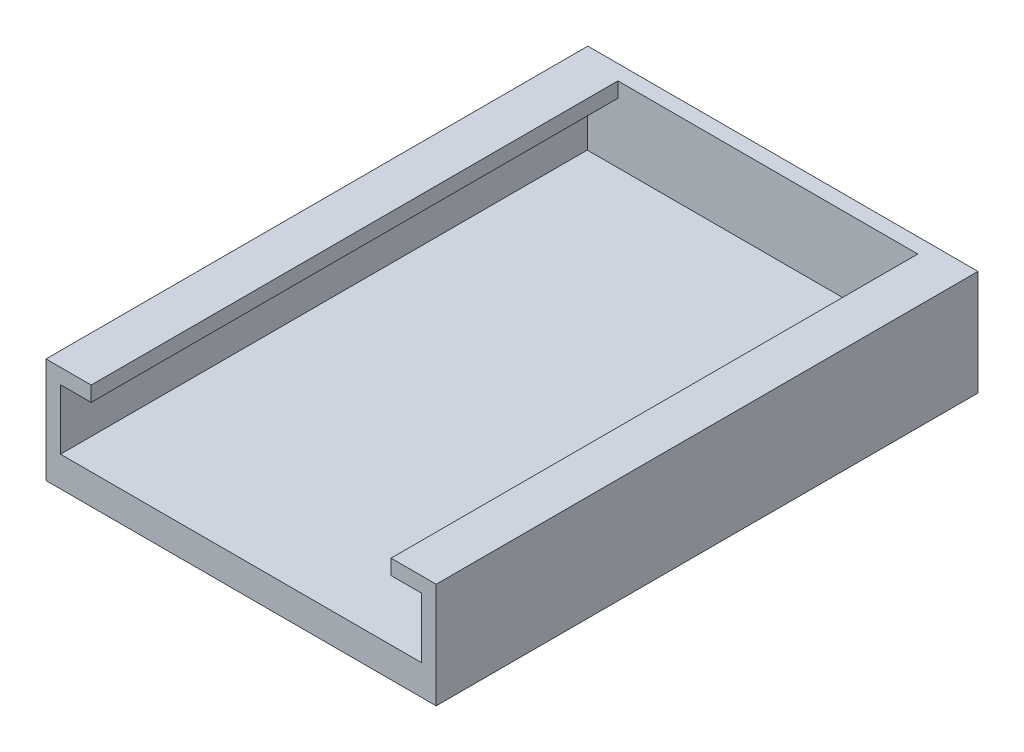
ISO-10303-21;
HEADER;
FILE_DESCRIPTION(('STEP AP214'),'2;1');
FILE_NAME('part.step','',(''),(''),'','','');
FILE_SCHEMA(('AUTOMOTIVE_DESIGN { 1 0 10303 214 1 1 1 1 }'));
ENDSEC;
DATA;
#1=APPLICATION_CONTEXT('core data for automotive mechanical design processes');
#2=APPLICATION_PROTOCOL_DEFINITION('international standard','automotive_design',2000,#1);
#3=PRODUCT_CONTEXT('',#1,'mechanical');
#4=PRODUCT('Part','Part','',(#3));
#5=PRODUCT_RELATED_PRODUCT_CATEGORY('part','',(#4));
#6=PRODUCT_DEFINITION_FORMATION('','',#4);
#7=PRODUCT_DEFINITION_CONTEXT('part definition',#1,'design');
#8=PRODUCT_DEFINITION('design','',#6,#7);
#9=PRODUCT_DEFINITION_SHAPE('','',#8);
#10=(LENGTH_UNIT() NAMED_UNIT(*) SI_UNIT(.MILLI.,.METRE.));
#11=(NAMED_UNIT(*) PLANE_ANGLE_UNIT() SI_UNIT($,.RADIAN.));
#12=(NAMED_UNIT(*) SI_UNIT($,.STERADIAN.) SOLID_ANGLE_UNIT());
#13=UNCERTAINTY_MEASURE_WITH_UNIT(LENGTH_MEASURE(1.E-05),#10,'distance_accuracy_value','');
#14=(GEOMETRIC_REPRESENTATION_CONTEXT(3) GLOBAL_UNCERTAINTY_ASSIGNED_CONTEXT((#13)) GLOBAL_UNIT_ASSIGNED_CONTEXT((#10,
#11,#12)) REPRESENTATION_CONTEXT('',''));
#15=CARTESIAN_POINT('',(0.,0.,0.));
#16=DIRECTION('',(0.,0.,1.));
#17=DIRECTION('',(1.,0.,0.));
#18=AXIS2_PLACEMENT_3D('',#15,#16,#17);
#19=CARTESIAN_POINT('',(12.9628378378378,7.,35.));
#20=DIRECTION('',(-1.,0.,0.));
#21=DIRECTION('',(0.,0.,1.));
#22=AXIS2_PLACEMENT_3D('',#19,#20,#21);
#23=PLANE('',#22);
#24=DIRECTION('',(0.,0.,-1.));
#25=VECTOR('',#24,1.);
#26=CARTESIAN_POINT('',(12.9628378378378,0.,35.));
#27=LINE('',#26,#25);
#28=CARTESIAN_POINT('',(12.9628378378378,0.,35.));
#29=VERTEX_POINT('',#28);
#30=CARTESIAN_POINT('',(12.9628378378378,0.,-1.));
#31=VERTEX_POINT('',#30);
#32=EDGE_CURVE('E11',#29,#31,#27,.T.);
#33=ORIENTED_EDGE('',*,*,#32,.T.);
#34=DIRECTION('',(0.,-1.,0.));
#35=VECTOR('',#34,1.);
#36=CARTESIAN_POINT('',(12.9628378378378,7.,-1.));
#37=LINE('',#36,#35);
#38=CARTESIAN_POINT('',(12.9628378378378,7.,-1.));
#39=VERTEX_POINT('',#38);
#40=EDGE_CURVE('E125',#39,#31,#37,.T.);
#41=ORIENTED_EDGE('',*,*,#40,.F.);
#42=DIRECTION('',(0.,0.,-1.));
#43=VECTOR('',#42,1.);
#44=CARTESIAN_POINT('',(12.9628378378378,7.,35.));
#45=LINE('',#44,#43);
#46=CARTESIAN_POINT('',(12.9628378378378,7.,35.));
#47=VERTEX_POINT('',#46);
#48=EDGE_CURVE('E48',#47,#39,#45,.T.);
#49=ORIENTED_EDGE('',*,*,#48,.F.);
#50=DIRECTION('',(0.,1.,0.));
#51=VECTOR('',#50,1.);
#52=CARTESIAN_POINT('',(12.9628378378378,7.,35.));
#53=LINE('',#52,#51);
#54=EDGE_CURVE('E126',#29,#47,#53,.T.);
#55=ORIENTED_EDGE('',*,*,#54,.F.);
#56=EDGE_LOOP('',(#33,#41,#49,#55));
#57=FACE_BOUND('',#56,.T.);
#58=ADVANCED_FACE('F39',(#57),#23,.F.);
#59=CARTESIAN_POINT('',(9.96283783783783,6.,35.));
#60=DIRECTION('',(1.,0.,0.));
#61=DIRECTION('',(0.,0.,-1.));
#62=AXIS2_PLACEMENT_3D('',#59,#60,#61);
#63=PLANE('',#62);
#64=DIRECTION('',(0.,-1.,0.));
#65=VECTOR('',#64,1.);
#66=CARTESIAN_POINT('',(9.96283783783783,6.,0.));
#67=LINE('',#66,#65);
#68=CARTESIAN_POINT('',(9.96283783783783,7.,0.));
#69=VERTEX_POINT('',#68);
#70=CARTESIAN_POINT('',(9.96283783783783,6.,0.));
#71=VERTEX_POINT('',#70);
#72=EDGE_CURVE('E152',#69,#71,#67,.T.);
#73=ORIENTED_EDGE('',*,*,#72,.T.);
#74=DIRECTION('',(0.,0.,-1.));
#75=VECTOR('',#74,1.);
#76=CARTESIAN_POINT('',(9.96283783783783,6.,35.));
#77=LINE('',#76,#75);
#78=CARTESIAN_POINT('',(9.96283783783783,6.,35.));
#79=VERTEX_POINT('',#78);
#80=EDGE_CURVE('E244',#79,#71,#77,.T.);
#81=ORIENTED_EDGE('',*,*,#80,.F.);
#82=DIRECTION('',(0.,-1.,0.));
#83=VECTOR('',#82,1.);
#84=CARTESIAN_POINT('',(9.96283783783783,6.,35.));
#85=LINE('',#84,#83);
#86=CARTESIAN_POINT('',(9.96283783783783,7.,35.));
#87=VERTEX_POINT('',#86);
#88=EDGE_CURVE('E162',#87,#79,#85,.T.);
#89=ORIENTED_EDGE('',*,*,#88,.F.);
#90=DIRECTION('',(0.,0.,-1.));
#91=VECTOR('',#90,1.);
#92=CARTESIAN_POINT('',(9.96283783783783,7.,35.));
#93=LINE('',#92,#91);
#94=EDGE_CURVE('E248',#87,#69,#93,.T.);
#95=ORIENTED_EDGE('',*,*,#94,.T.);
#96=EDGE_LOOP('',(#73,#81,#89,#95));
#97=FACE_BOUND('',#96,.T.);
#98=ADVANCED_FACE('F293',(#97),#63,.F.);
#99=CARTESIAN_POINT('',(12.,6.,35.));
#100=DIRECTION('',(0.,1.,0.));
#101=DIRECTION('',(0.,0.,1.));
#102=AXIS2_PLACEMENT_3D('',#99,#100,#101);
#103=PLANE('',#102);
#104=DIRECTION('',(1.,0.,0.));
#105=VECTOR('',#104,1.);
#106=CARTESIAN_POINT('',(12.,6.,0.));
#107=LINE('',#106,#105);
#108=CARTESIAN_POINT('',(12.,6.,0.));
#109=VERTEX_POINT('',#108);
#110=EDGE_CURVE('E192',#71,#109,#107,.T.);
#111=ORIENTED_EDGE('',*,*,#110,.T.);
#112=DIRECTION('',(0.,0.,-1.));
#113=VECTOR('',#112,1.);
#114=CARTESIAN_POINT('',(12.,6.,35.));
#115=LINE('',#114,#113);
#116=CARTESIAN_POINT('',(12.,6.,35.));
#117=VERTEX_POINT('',#116);
#118=EDGE_CURVE('E240',#117,#109,#115,.T.);
#119=ORIENTED_EDGE('',*,*,#118,.F.);
#120=DIRECTION('',(1.,0.,0.));
#121=VECTOR('',#120,1.);
#122=CARTESIAN_POINT('',(12.,6.,35.));
#123=LINE('',#122,#121);
#124=EDGE_CURVE('E165',#79,#117,#123,.T.);
#125=ORIENTED_EDGE('',*,*,#124,.F.);
#126=ORIENTED_EDGE('',*,*,#80,.T.);
#127=EDGE_LOOP('',(#111,#119,#125,#126));
#128=FACE_BOUND('',#127,.T.);
#129=ADVANCED_FACE('F290',(#128),#103,.F.);
#130=CARTESIAN_POINT('',(12.,2.,35.));
#131=DIRECTION('',(1.,0.,0.));
#132=DIRECTION('',(0.,0.,-1.));
#133=AXIS2_PLACEMENT_3D('',#130,#131,#132);
#134=PLANE('',#133);
#135=DIRECTION('',(0.,-1.,0.));
#136=VECTOR('',#135,1.);
#137=CARTESIAN_POINT('',(12.,2.,0.));
#138=LINE('',#137,#136);
#139=CARTESIAN_POINT('',(12.,2.,0.));
#140=VERTEX_POINT('',#139);
#141=EDGE_CURVE('E196',#109,#140,#138,.T.);
#142=ORIENTED_EDGE('',*,*,#141,.T.);
#143=DIRECTION('',(0.,0.,-1.));
#144=VECTOR('',#143,1.);
#145=CARTESIAN_POINT('',(12.,2.,35.));
#146=LINE('',#145,#144);
#147=CARTESIAN_POINT('',(12.,2.,35.));
#148=VERTEX_POINT('',#147);
#149=EDGE_CURVE('E236',#148,#140,#146,.T.);
#150=ORIENTED_EDGE('',*,*,#149,.F.);
#151=DIRECTION('',(0.,-1.,0.));
#152=VECTOR('',#151,1.);
#153=CARTESIAN_POINT('',(12.,2.,35.));
#154=LINE('',#153,#152);
#155=EDGE_CURVE('E168',#117,#148,#154,.T.);
#156=ORIENTED_EDGE('',*,*,#155,.F.);
#157=ORIENTED_EDGE('',*,*,#118,.T.);
#158=EDGE_LOOP('',(#142,#150,#156,#157));
#159=FACE_BOUND('',#158,.T.);
#160=ADVANCED_FACE('F286',(#159),#134,.F.);
#161=CARTESIAN_POINT('',(-10.,2.,35.));
#162=DIRECTION('',(0.,-1.,0.));
#163=DIRECTION('',(0.,0.,-1.));
#164=AXIS2_PLACEMENT_3D('',#161,#162,#163);
#165=PLANE('',#164);
#166=DIRECTION('',(-1.,0.,0.));
#167=VECTOR('',#166,1.);
#168=CARTESIAN_POINT('',(-10.,2.,0.));
#169=LINE('',#168,#167);
#170=CARTESIAN_POINT('',(-12.,2.,0.));
#171=VERTEX_POINT('',#170);
#172=EDGE_CURVE('E200',#140,#171,#169,.T.);
#173=ORIENTED_EDGE('',*,*,#172,.T.);
#174=DIRECTION('',(0.,0.,-1.));
#175=VECTOR('',#174,1.);
#176=CARTESIAN_POINT('',(-12.,2.,35.));
#177=LINE('',#176,#175);
#178=CARTESIAN_POINT('',(-12.,2.,35.));
#179=VERTEX_POINT('',#178);
#180=EDGE_CURVE('E232',#179,#171,#177,.T.);
#181=ORIENTED_EDGE('',*,*,#180,.F.);
#182=DIRECTION('',(-1.,0.,0.));
#183=VECTOR('',#182,1.);
#184=CARTESIAN_POINT('',(10.,2.,35.));
#185=LINE('',#184,#183);
#186=EDGE_CURVE('E171',#148,#179,#185,.T.);
#187=ORIENTED_EDGE('',*,*,#186,.F.);
#188=ORIENTED_EDGE('',*,*,#149,.T.);
#189=EDGE_LOOP('',(#173,#181,#187,#188));
#190=FACE_BOUND('',#189,.T.);
#191=ADVANCED_FACE('F281',(#190),#165,.F.);
#192=CARTESIAN_POINT('',(-12.,2.,35.));
#193=DIRECTION('',(-1.,0.,0.));
#194=DIRECTION('',(0.,0.,1.));
#195=AXIS2_PLACEMENT_3D('',#192,#193,#194);
#196=PLANE('',#195);
#197=DIRECTION('',(0.,1.,0.));
#198=VECTOR('',#197,1.);
#199=CARTESIAN_POINT('',(-12.,2.,0.));
#200=LINE('',#199,#198);
#201=CARTESIAN_POINT('',(-12.,6.,0.));
#202=VERTEX_POINT('',#201);
#203=EDGE_CURVE('E204',#171,#202,#200,.T.);
#204=ORIENTED_EDGE('',*,*,#203,.T.);
#205=DIRECTION('',(0.,0.,-1.));
#206=VECTOR('',#205,1.);
#207=CARTESIAN_POINT('',(-12.,6.,35.));
#208=LINE('',#207,#206);
#209=CARTESIAN_POINT('',(-12.,6.,35.));
#210=VERTEX_POINT('',#209);
#211=EDGE_CURVE('E228',#210,#202,#208,.T.);
#212=ORIENTED_EDGE('',*,*,#211,.F.);
#213=DIRECTION('',(0.,1.,0.));
#214=VECTOR('',#213,1.);
#215=CARTESIAN_POINT('',(-12.,2.,35.));
#216=LINE('',#215,#214);
#217=EDGE_CURVE('E174',#179,#210,#216,.T.);
#218=ORIENTED_EDGE('',*,*,#217,.F.);
#219=ORIENTED_EDGE('',*,*,#180,.T.);
#220=EDGE_LOOP('',(#204,#212,#218,#219));
#221=FACE_BOUND('',#220,.T.);
#222=ADVANCED_FACE('F278',(#221),#196,.F.);
#223=CARTESIAN_POINT('',(-12.,6.,35.));
#224=DIRECTION('',(0.,1.,0.));
#225=DIRECTION('',(0.,0.,1.));
#226=AXIS2_PLACEMENT_3D('',#223,#224,#225);
#227=PLANE('',#226);
#228=DIRECTION('',(1.,0.,0.));
#229=VECTOR('',#228,1.);
#230=CARTESIAN_POINT('',(-12.,6.,0.));
#231=LINE('',#230,#229);
#232=CARTESIAN_POINT('',(-9.96283783783783,6.,0.));
#233=VERTEX_POINT('',#232);
#234=EDGE_CURVE('E208',#202,#233,#231,.T.);
#235=ORIENTED_EDGE('',*,*,#234,.T.);
#236=DIRECTION('',(0.,0.,-1.));
#237=VECTOR('',#236,1.);
#238=CARTESIAN_POINT('',(-9.96283783783783,6.,35.));
#239=LINE('',#238,#237);
#240=CARTESIAN_POINT('',(-9.96283783783783,6.,35.));
#241=VERTEX_POINT('',#240);
#242=EDGE_CURVE('E224',#241,#233,#239,.T.);
#243=ORIENTED_EDGE('',*,*,#242,.F.);
#244=DIRECTION('',(1.,0.,0.));
#245=VECTOR('',#244,1.);
#246=CARTESIAN_POINT('',(-12.,6.,35.));
#247=LINE('',#246,#245);
#248=EDGE_CURVE('E177',#210,#241,#247,.T.);
#249=ORIENTED_EDGE('',*,*,#248,.F.);
#250=ORIENTED_EDGE('',*,*,#211,.T.);
#251=EDGE_LOOP('',(#235,#243,#249,#250));
#252=FACE_BOUND('',#251,.T.);
#253=ADVANCED_FACE('F273',(#252),#227,.F.);
#254=CARTESIAN_POINT('',(-9.96283783783783,6.,35.));
#255=DIRECTION('',(-1.,0.,0.));
#256=DIRECTION('',(0.,0.,1.));
#257=AXIS2_PLACEMENT_3D('',#254,#255,#256);
#258=PLANE('',#257);
#259=DIRECTION('',(0.,1.,0.));
#260=VECTOR('',#259,1.);
#261=CARTESIAN_POINT('',(-9.96283783783783,6.,0.));
#262=LINE('',#261,#260);
#263=CARTESIAN_POINT('',(-9.96283783783783,7.,0.));
#264=VERTEX_POINT('',#263);
#265=EDGE_CURVE('E156',#233,#264,#262,.T.);
#266=ORIENTED_EDGE('',*,*,#265,.T.);
#267=DIRECTION('',(0.,0.,-1.));
#268=VECTOR('',#267,1.);
#269=CARTESIAN_POINT('',(-9.96283783783783,7.,35.));
#270=LINE('',#269,#268);
#271=CARTESIAN_POINT('',(-9.96283783783783,7.,35.));
#272=VERTEX_POINT('',#271);
#273=EDGE_CURVE('E220',#272,#264,#270,.T.);
#274=ORIENTED_EDGE('',*,*,#273,.F.);
#275=DIRECTION('',(0.,1.,0.));
#276=VECTOR('',#275,1.);
#277=CARTESIAN_POINT('',(-9.96283783783783,6.,35.));
#278=LINE('',#277,#276);
#279=EDGE_CURVE('E180',#241,#272,#278,.T.);
#280=ORIENTED_EDGE('',*,*,#279,.F.);
#281=ORIENTED_EDGE('',*,*,#242,.T.);
#282=EDGE_LOOP('',(#266,#274,#280,#281));
#283=FACE_BOUND('',#282,.T.);
#284=ADVANCED_FACE('F268',(#283),#258,.F.);
#285=CARTESIAN_POINT('',(-9.96283783783783,7.,35.));
#286=DIRECTION('',(0.,-1.,0.));
#287=DIRECTION('',(1.,0.,0.));
#288=AXIS2_PLACEMENT_3D('',#285,#286,#287);
#289=PLANE('',#288);
#290=ORIENTED_EDGE('',*,*,#273,.T.);
#291=DIRECTION('',(1.,0.,0.));
#292=VECTOR('',#291,1.);
#293=CARTESIAN_POINT('',(12.9628378378378,7.,0.));
#294=LINE('',#293,#292);
#295=EDGE_CURVE('E143',#264,#69,#294,.T.);
#296=ORIENTED_EDGE('',*,*,#295,.T.);
#297=ORIENTED_EDGE('',*,*,#94,.F.);
#298=DIRECTION('',(-1.,0.,0.));
#299=VECTOR('',#298,1.);
#300=CARTESIAN_POINT('',(9.96283783783783,7.,35.));
#301=LINE('',#300,#299);
#302=EDGE_CURVE('E159',#47,#87,#301,.T.);
#303=ORIENTED_EDGE('',*,*,#302,.F.);
#304=ORIENTED_EDGE('',*,*,#48,.T.);
#305=DIRECTION('',(1.,0.,0.));
#306=VECTOR('',#305,1.);
#307=CARTESIAN_POINT('',(12.9628378378378,7.,-1.));
#308=LINE('',#307,#306);
#309=CARTESIAN_POINT('',(-12.9628378378378,7.,-1.));
#310=VERTEX_POINT('',#309);
#311=EDGE_CURVE('E141',#310,#39,#308,.T.);
#312=ORIENTED_EDGE('',*,*,#311,.F.);
#313=DIRECTION('',(0.,0.,-1.));
#314=VECTOR('',#313,1.);
#315=CARTESIAN_POINT('',(-12.9628378378378,7.,35.));
#316=LINE('',#315,#314);
#317=CARTESIAN_POINT('',(-12.9628378378378,7.,35.));
#318=VERTEX_POINT('',#317);
#319=EDGE_CURVE('E217',#318,#310,#316,.T.);
#320=ORIENTED_EDGE('',*,*,#319,.F.);
#321=DIRECTION('',(-1.,0.,0.));
#322=VECTOR('',#321,1.);
#323=CARTESIAN_POINT('',(-9.96283783783783,7.,35.));
#324=LINE('',#323,#322);
#325=EDGE_CURVE('E183',#272,#318,#324,.T.);
#326=ORIENTED_EDGE('',*,*,#325,.F.);
#327=EDGE_LOOP('',(#290,#296,#297,#303,#304,#312,#320,#326));
#328=FACE_BOUND('',#327,.T.);
#329=ADVANCED_FACE('F254',(#328),#289,.F.);
#330=CARTESIAN_POINT('',(-12.9628378378378,7.,35.));
#331=DIRECTION('',(1.,0.,0.));
#332=DIRECTION('',(0.,0.,-1.));
#333=AXIS2_PLACEMENT_3D('',#330,#331,#332);
#334=PLANE('',#333);
#335=ORIENTED_EDGE('',*,*,#319,.T.);
#336=DIRECTION('',(0.,1.,0.));
#337=VECTOR('',#336,1.);
#338=CARTESIAN_POINT('',(-12.9628378378378,7.,-1.));
#339=LINE('',#338,#337);
#340=CARTESIAN_POINT('',(-12.9628378378378,0.,-1.));
#341=VERTEX_POINT('',#340);
#342=EDGE_CURVE('E136',#341,#310,#339,.T.);
#343=ORIENTED_EDGE('',*,*,#342,.F.);
#344=DIRECTION('',(0.,0.,-1.));
#345=VECTOR('',#344,1.);
#346=CARTESIAN_POINT('',(-12.9628378378378,0.,35.));
#347=LINE('',#346,#345);
#348=CARTESIAN_POINT('',(-12.9628378378378,0.,35.));
#349=VERTEX_POINT('',#348);
#350=EDGE_CURVE('E131',#349,#341,#347,.T.);
#351=ORIENTED_EDGE('',*,*,#350,.F.);
#352=DIRECTION('',(0.,-1.,0.));
#353=VECTOR('',#352,1.);
#354=CARTESIAN_POINT('',(-12.9628378378378,7.,35.));
#355=LINE('',#354,#353);
#356=EDGE_CURVE('E186',#318,#349,#355,.T.);
#357=ORIENTED_EDGE('',*,*,#356,.F.);
#358=EDGE_LOOP('',(#335,#343,#351,#357));
#359=FACE_BOUND('',#358,.T.);
#360=ADVANCED_FACE('F264',(#359),#334,.F.);
#361=CARTESIAN_POINT('',(-10.,0.,35.));
#362=DIRECTION('',(0.,1.,0.));
#363=DIRECTION('',(0.,0.,1.));
#364=AXIS2_PLACEMENT_3D('',#361,#362,#363);
#365=PLANE('',#364);
#366=ORIENTED_EDGE('',*,*,#350,.T.);
#367=DIRECTION('',(-1.,0.,0.));
#368=VECTOR('',#367,1.);
#369=CARTESIAN_POINT('',(12.9628378378378,0.,-1.));
#370=LINE('',#369,#368);
#371=EDGE_CURVE('E128',#31,#341,#370,.T.);
#372=ORIENTED_EDGE('',*,*,#371,.F.);
#373=ORIENTED_EDGE('',*,*,#32,.F.);
#374=DIRECTION('',(1.,0.,0.));
#375=VECTOR('',#374,1.);
#376=CARTESIAN_POINT('',(12.9628378378378,0.,35.));
#377=LINE('',#376,#375);
#378=EDGE_CURVE('E55',#349,#29,#377,.T.);
#379=ORIENTED_EDGE('',*,*,#378,.F.);
#380=EDGE_LOOP('',(#366,#372,#373,#379));
#381=FACE_BOUND('',#380,.T.);
#382=ADVANCED_FACE('F129',(#381),#365,.F.);
#383=CARTESIAN_POINT('',(0.,0.,35.));
#384=DIRECTION('',(0.,0.,1.));
#385=DIRECTION('',(1.,0.,0.));
#386=AXIS2_PLACEMENT_3D('',#383,#384,#385);
#387=PLANE('',#386);
#388=ORIENTED_EDGE('',*,*,#378,.T.);
#389=ORIENTED_EDGE('',*,*,#54,.T.);
#390=ORIENTED_EDGE('',*,*,#302,.T.);
#391=ORIENTED_EDGE('',*,*,#88,.T.);
#392=ORIENTED_EDGE('',*,*,#124,.T.);
#393=ORIENTED_EDGE('',*,*,#155,.T.);
#394=ORIENTED_EDGE('',*,*,#186,.T.);
#395=ORIENTED_EDGE('',*,*,#217,.T.);
#396=ORIENTED_EDGE('',*,*,#248,.T.);
#397=ORIENTED_EDGE('',*,*,#279,.T.);
#398=ORIENTED_EDGE('',*,*,#325,.T.);
#399=ORIENTED_EDGE('',*,*,#356,.T.);
#400=EDGE_LOOP('',(#388,#389,#390,#391,#392,#393,#394,#395,#396,#397,#398,#399));
#401=FACE_BOUND('',#400,.T.);
#402=ADVANCED_FACE('F259',(#401),#387,.T.);
#403=CARTESIAN_POINT('',(0.,0.,-1.));
#404=DIRECTION('',(0.,0.,-1.));
#405=DIRECTION('',(-1.,0.,0.));
#406=AXIS2_PLACEMENT_3D('',#403,#404,#405);
#407=PLANE('',#406);
#408=ORIENTED_EDGE('',*,*,#40,.T.);
#409=ORIENTED_EDGE('',*,*,#371,.T.);
#410=ORIENTED_EDGE('',*,*,#342,.T.);
#411=ORIENTED_EDGE('',*,*,#311,.T.);
#412=EDGE_LOOP('',(#408,#409,#410,#411));
#413=FACE_BOUND('',#412,.T.);
#414=ADVANCED_FACE('F139',(#413),#407,.T.);
#415=CARTESIAN_POINT('',(0.,0.,0.));
#416=DIRECTION('',(0.,0.,-1.));
#417=DIRECTION('',(-1.,0.,0.));
#418=AXIS2_PLACEMENT_3D('',#415,#416,#417);
#419=PLANE('',#418);
#420=ORIENTED_EDGE('',*,*,#265,.F.);
#421=ORIENTED_EDGE('',*,*,#234,.F.);
#422=ORIENTED_EDGE('',*,*,#203,.F.);
#423=ORIENTED_EDGE('',*,*,#172,.F.);
#424=ORIENTED_EDGE('',*,*,#141,.F.);
#425=ORIENTED_EDGE('',*,*,#110,.F.);
#426=ORIENTED_EDGE('',*,*,#72,.F.);
#427=ORIENTED_EDGE('',*,*,#295,.F.);
#428=EDGE_LOOP('',(#420,#421,#422,#423,#424,#425,#426,#427));
#429=FACE_BOUND('',#428,.T.);
#430=ADVANCED_FACE('F271',(#429),#419,.F.);
#431=CLOSED_SHELL('',(#58,#98,#129,#160,#191,#222,#253,#284,#329,#360,#382,#402,#414,#430));
#432=MANIFOLD_SOLID_BREP('B2',#431);
#433=ADVANCED_BREP_SHAPE_REPRESENTATION('',(#18,#432),#14);
#434=SHAPE_DEFINITION_REPRESENTATION(#9,#433);
ENDSEC;
END-ISO-10303-21;
